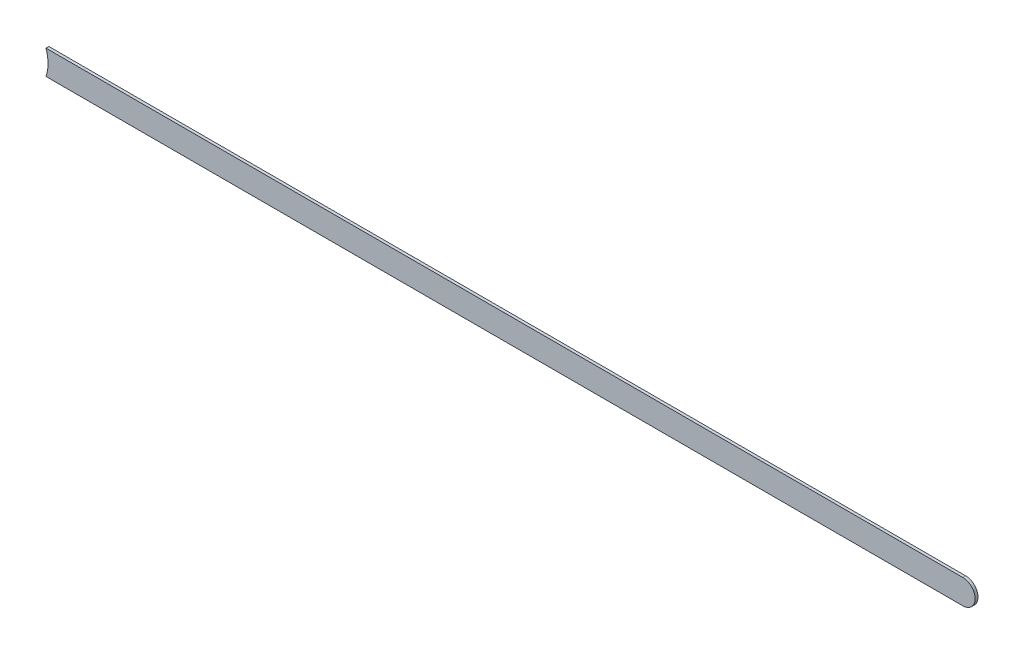
ISO-10303-21;
HEADER;
FILE_DESCRIPTION(('STEP AP214'),'2;1');
FILE_NAME('part.step','',(''),(''),'','','');
FILE_SCHEMA(('AUTOMOTIVE_DESIGN { 1 0 10303 214 1 1 1 1 }'));
ENDSEC;
DATA;
#1=APPLICATION_CONTEXT('core data for automotive mechanical design processes');
#2=APPLICATION_PROTOCOL_DEFINITION('international standard','automotive_design',2000,#1);
#3=PRODUCT_CONTEXT('',#1,'mechanical');
#4=PRODUCT('Part','Part','',(#3));
#5=PRODUCT_RELATED_PRODUCT_CATEGORY('part','',(#4));
#6=PRODUCT_DEFINITION_FORMATION('','',#4);
#7=PRODUCT_DEFINITION_CONTEXT('part definition',#1,'design');
#8=PRODUCT_DEFINITION('design','',#6,#7);
#9=PRODUCT_DEFINITION_SHAPE('','',#8);
#10=(LENGTH_UNIT() NAMED_UNIT(*) SI_UNIT(.MILLI.,.METRE.));
#11=(NAMED_UNIT(*) PLANE_ANGLE_UNIT() SI_UNIT($,.RADIAN.));
#12=(NAMED_UNIT(*) SI_UNIT($,.STERADIAN.) SOLID_ANGLE_UNIT());
#13=UNCERTAINTY_MEASURE_WITH_UNIT(LENGTH_MEASURE(1.E-05),#10,'distance_accuracy_value','');
#14=(GEOMETRIC_REPRESENTATION_CONTEXT(3) GLOBAL_UNCERTAINTY_ASSIGNED_CONTEXT((#13)) GLOBAL_UNIT_ASSIGNED_CONTEXT((#10,
#11,#12)) REPRESENTATION_CONTEXT('',''));
#15=CARTESIAN_POINT('',(0.,0.,0.));
#16=DIRECTION('',(0.,0.,1.));
#17=DIRECTION('',(1.,0.,0.));
#18=AXIS2_PLACEMENT_3D('',#15,#16,#17);
#19=CARTESIAN_POINT('',(81.265,-122.225,1.6));
#20=DIRECTION('',(0.,1.,0.));
#21=DIRECTION('',(1.,0.,0.));
#22=AXIS2_PLACEMENT_3D('',#19,#20,#21);
#23=PLANE('',#22);
#24=DIRECTION('',(0.,0.,1.));
#25=VECTOR('',#24,1.);
#26=CARTESIAN_POINT('',(92.91,-122.225,1.6));
#27=LINE('',#26,#25);
#28=CARTESIAN_POINT('',(92.91,-122.225,1.6));
#29=VERTEX_POINT('',#28);
#30=CARTESIAN_POINT('',(92.91,-122.225,1.635));
#31=VERTEX_POINT('',#30);
#32=EDGE_CURVE('E11',#29,#31,#27,.T.);
#33=ORIENTED_EDGE('',*,*,#32,.T.);
#34=DIRECTION('',(1.,0.,0.));
#35=VECTOR('',#34,1.);
#36=CARTESIAN_POINT('',(81.265,-122.225,1.635));
#37=LINE('',#36,#35);
#38=CARTESIAN_POINT('',(81.715693909433,-122.225,1.635));
#39=VERTEX_POINT('',#38);
#40=EDGE_CURVE('E26',#39,#31,#37,.T.);
#41=ORIENTED_EDGE('',*,*,#40,.F.);
#42=DIRECTION('',(0.,0.,-1.));
#43=VECTOR('',#42,1.);
#44=CARTESIAN_POINT('',(81.715693909433,-122.225,-0.045));
#45=LINE('',#44,#43);
#46=CARTESIAN_POINT('',(81.715693909433,-122.225,1.6));
#47=VERTEX_POINT('',#46);
#48=EDGE_CURVE('E81',#39,#47,#45,.T.);
#49=ORIENTED_EDGE('',*,*,#48,.T.);
#50=DIRECTION('',(1.,0.,0.));
#51=VECTOR('',#50,1.);
#52=CARTESIAN_POINT('',(81.265,-122.225,1.6));
#53=LINE('',#52,#51);
#54=EDGE_CURVE('E72',#47,#29,#53,.T.);
#55=ORIENTED_EDGE('',*,*,#54,.T.);
#56=EDGE_LOOP('',(#33,#41,#49,#55));
#57=FACE_BOUND('',#56,.T.);
#58=ADVANCED_FACE('F17',(#57),#23,.F.);
#59=CARTESIAN_POINT('',(92.91,-122.075,1.6));
#60=DIRECTION('',(0.,0.,-1.));
#61=DIRECTION('',(0.,-1.,0.));
#62=AXIS2_PLACEMENT_3D('',#59,#60,#61);
#63=CYLINDRICAL_SURFACE('',#62,0.15);
#64=CARTESIAN_POINT('',(92.91,-122.075,1.6));
#65=DIRECTION('',(0.,0.,1.));
#66=DIRECTION('',(0.,-1.,0.));
#67=AXIS2_PLACEMENT_3D('',#64,#65,#66);
#68=CIRCLE('',#67,0.15);
#69=CARTESIAN_POINT('',(92.91,-121.925,1.6));
#70=VERTEX_POINT('',#69);
#71=EDGE_CURVE('E66',#29,#70,#68,.T.);
#72=ORIENTED_EDGE('',*,*,#71,.T.);
#73=DIRECTION('',(0.,0.,1.));
#74=VECTOR('',#73,1.);
#75=CARTESIAN_POINT('',(92.91,-121.925,1.6));
#76=LINE('',#75,#74);
#77=CARTESIAN_POINT('',(92.91,-121.925,1.635));
#78=VERTEX_POINT('',#77);
#79=EDGE_CURVE('E91',#70,#78,#76,.T.);
#80=ORIENTED_EDGE('',*,*,#79,.T.);
#81=CARTESIAN_POINT('',(92.91,-122.075,1.635));
#82=DIRECTION('',(0.,0.,1.));
#83=DIRECTION('',(0.,-1.,0.));
#84=AXIS2_PLACEMENT_3D('',#81,#82,#83);
#85=CIRCLE('',#84,0.15);
#86=EDGE_CURVE('E68',#31,#78,#85,.T.);
#87=ORIENTED_EDGE('',*,*,#86,.F.);
#88=ORIENTED_EDGE('',*,*,#32,.F.);
#89=EDGE_LOOP('',(#72,#80,#87,#88));
#90=FACE_BOUND('',#89,.T.);
#91=ADVANCED_FACE('F64',(#90),#63,.T.);
#92=CARTESIAN_POINT('',(92.91,-121.925,1.635));
#93=DIRECTION('',(0.,0.,1.));
#94=DIRECTION('',(1.,0.,0.));
#95=AXIS2_PLACEMENT_3D('',#92,#93,#94);
#96=PLANE('',#95);
#97=ORIENTED_EDGE('',*,*,#86,.T.);
#98=DIRECTION('',(-1.,0.,0.));
#99=VECTOR('',#98,1.);
#100=CARTESIAN_POINT('',(92.91,-121.925,1.635));
#101=LINE('',#100,#99);
#102=CARTESIAN_POINT('',(81.715693909432,-121.925,1.635));
#103=VERTEX_POINT('',#102);
#104=EDGE_CURVE('E96',#78,#103,#101,.T.);
#105=ORIENTED_EDGE('',*,*,#104,.T.);
#106=CARTESIAN_POINT('',(81.265,-122.075,1.635));
#107=DIRECTION('',(0.,0.,-1.));
#108=DIRECTION('',(0.,-1.,0.));
#109=AXIS2_PLACEMENT_3D('',#106,#107,#108);
#110=CIRCLE('',#109,0.475);
#111=EDGE_CURVE('E77',#103,#39,#110,.T.);
#112=ORIENTED_EDGE('',*,*,#111,.T.);
#113=ORIENTED_EDGE('',*,*,#40,.T.);
#114=EDGE_LOOP('',(#97,#105,#112,#113));
#115=FACE_BOUND('',#114,.T.);
#116=ADVANCED_FACE('F112',(#115),#96,.T.);
#117=CARTESIAN_POINT('',(81.265,-122.075,-0.045));
#118=DIRECTION('',(0.,0.,-1.));
#119=DIRECTION('',(0.,-1.,0.));
#120=AXIS2_PLACEMENT_3D('',#117,#118,#119);
#121=CYLINDRICAL_SURFACE('',#120,0.475);
#122=ORIENTED_EDGE('',*,*,#111,.F.);
#123=DIRECTION('',(0.,0.,-1.));
#124=VECTOR('',#123,1.);
#125=CARTESIAN_POINT('',(81.715693909433,-121.925,-0.045));
#126=LINE('',#125,#124);
#127=CARTESIAN_POINT('',(81.715693909432,-121.925,1.6));
#128=VERTEX_POINT('',#127);
#129=EDGE_CURVE('E95',#103,#128,#126,.T.);
#130=ORIENTED_EDGE('',*,*,#129,.T.);
#131=CARTESIAN_POINT('',(81.265,-122.075,1.6));
#132=DIRECTION('',(0.,0.,-1.));
#133=DIRECTION('',(0.,-1.,0.));
#134=AXIS2_PLACEMENT_3D('',#131,#132,#133);
#135=CIRCLE('',#134,0.475);
#136=EDGE_CURVE('E78',#128,#47,#135,.T.);
#137=ORIENTED_EDGE('',*,*,#136,.T.);
#138=ORIENTED_EDGE('',*,*,#48,.F.);
#139=EDGE_LOOP('',(#122,#130,#137,#138));
#140=FACE_BOUND('',#139,.T.);
#141=ADVANCED_FACE('F154',(#140),#121,.F.);
#142=CARTESIAN_POINT('',(92.91,-121.925,1.6));
#143=DIRECTION('',(0.,0.,1.));
#144=DIRECTION('',(1.,0.,0.));
#145=AXIS2_PLACEMENT_3D('',#142,#143,#144);
#146=PLANE('',#145);
#147=ORIENTED_EDGE('',*,*,#54,.F.);
#148=ORIENTED_EDGE('',*,*,#136,.F.);
#149=DIRECTION('',(-1.,0.,0.));
#150=VECTOR('',#149,1.);
#151=CARTESIAN_POINT('',(92.91,-121.925,1.6));
#152=LINE('',#151,#150);
#153=EDGE_CURVE('E74',#70,#128,#152,.T.);
#154=ORIENTED_EDGE('',*,*,#153,.F.);
#155=ORIENTED_EDGE('',*,*,#71,.F.);
#156=EDGE_LOOP('',(#147,#148,#154,#155));
#157=FACE_BOUND('',#156,.T.);
#158=ADVANCED_FACE('F71',(#157),#146,.F.);
#159=CARTESIAN_POINT('',(92.91,-121.925,1.6));
#160=DIRECTION('',(0.,-1.,0.));
#161=DIRECTION('',(0.,0.,-1.));
#162=AXIS2_PLACEMENT_3D('',#159,#160,#161);
#163=PLANE('',#162);
#164=ORIENTED_EDGE('',*,*,#129,.F.);
#165=ORIENTED_EDGE('',*,*,#104,.F.);
#166=ORIENTED_EDGE('',*,*,#79,.F.);
#167=ORIENTED_EDGE('',*,*,#153,.T.);
#168=EDGE_LOOP('',(#164,#165,#166,#167));
#169=FACE_BOUND('',#168,.T.);
#170=ADVANCED_FACE('F116',(#169),#163,.F.);
#171=CLOSED_SHELL('',(#58,#91,#116,#141,#158,#170));
#172=MANIFOLD_SOLID_BREP('B1',#171);
#173=ADVANCED_BREP_SHAPE_REPRESENTATION('',(#18,#172),#14);
#174=SHAPE_DEFINITION_REPRESENTATION(#9,#173);
ENDSEC;
END-ISO-10303-21;
